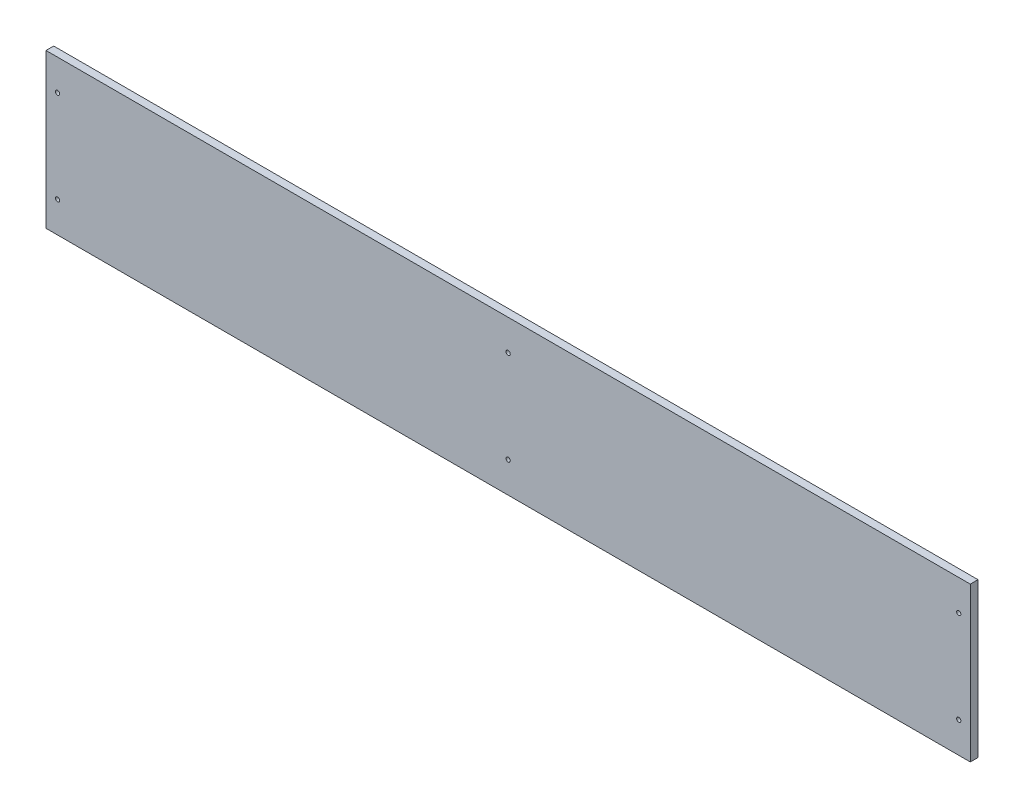
ISO-10303-21;
HEADER;
FILE_DESCRIPTION(('STEP AP214'),'2;1');
FILE_NAME('part.step','',(''),(''),'','','');
FILE_SCHEMA(('AUTOMOTIVE_DESIGN { 1 0 10303 214 1 1 1 1 }'));
ENDSEC;
DATA;
#1=APPLICATION_CONTEXT('core data for automotive mechanical design processes');
#2=APPLICATION_PROTOCOL_DEFINITION('international standard','automotive_design',2000,#1);
#3=PRODUCT_CONTEXT('',#1,'mechanical');
#4=PRODUCT('Part','Part','',(#3));
#5=PRODUCT_RELATED_PRODUCT_CATEGORY('part','',(#4));
#6=PRODUCT_DEFINITION_FORMATION('','',#4);
#7=PRODUCT_DEFINITION_CONTEXT('part definition',#1,'design');
#8=PRODUCT_DEFINITION('design','',#6,#7);
#9=PRODUCT_DEFINITION_SHAPE('','',#8);
#10=(LENGTH_UNIT() NAMED_UNIT(*) SI_UNIT(.MILLI.,.METRE.));
#11=(NAMED_UNIT(*) PLANE_ANGLE_UNIT() SI_UNIT($,.RADIAN.));
#12=(NAMED_UNIT(*) SI_UNIT($,.STERADIAN.) SOLID_ANGLE_UNIT());
#13=UNCERTAINTY_MEASURE_WITH_UNIT(LENGTH_MEASURE(1.E-05),#10,'distance_accuracy_value','');
#14=(GEOMETRIC_REPRESENTATION_CONTEXT(3) GLOBAL_UNCERTAINTY_ASSIGNED_CONTEXT((#13)) GLOBAL_UNIT_ASSIGNED_CONTEXT((#10,
#11,#12)) REPRESENTATION_CONTEXT('',''));
#15=CARTESIAN_POINT('',(0.,0.,0.));
#16=DIRECTION('',(0.,0.,1.));
#17=DIRECTION('',(1.,0.,0.));
#18=AXIS2_PLACEMENT_3D('',#15,#16,#17);
#19=CARTESIAN_POINT('',(0.,0.,10.));
#20=DIRECTION('',(1.,0.,0.));
#21=DIRECTION('',(0.,1.,0.));
#22=AXIS2_PLACEMENT_3D('',#19,#20,#21);
#23=PLANE('',#22);
#24=DIRECTION('',(0.,-1.,0.));
#25=VECTOR('',#24,1.);
#26=CARTESIAN_POINT('',(0.,0.,0.));
#27=LINE('',#26,#25);
#28=CARTESIAN_POINT('',(0.,0.,0.));
#29=VERTEX_POINT('',#28);
#30=CARTESIAN_POINT('',(0.,-200.,0.));
#31=VERTEX_POINT('',#30);
#32=EDGE_CURVE('E101',#29,#31,#27,.T.);
#33=ORIENTED_EDGE('',*,*,#32,.T.);
#34=DIRECTION('',(0.,0.,-1.));
#35=VECTOR('',#34,1.);
#36=CARTESIAN_POINT('',(0.,-200.,10.));
#37=LINE('',#36,#35);
#38=CARTESIAN_POINT('',(0.,-200.,10.));
#39=VERTEX_POINT('',#38);
#40=EDGE_CURVE('E92',#39,#31,#37,.T.);
#41=ORIENTED_EDGE('',*,*,#40,.F.);
#42=DIRECTION('',(0.,-1.,0.));
#43=VECTOR('',#42,1.);
#44=CARTESIAN_POINT('',(0.,0.,10.));
#45=LINE('',#44,#43);
#46=CARTESIAN_POINT('',(0.,0.,10.));
#47=VERTEX_POINT('',#46);
#48=EDGE_CURVE('E86',#47,#39,#45,.T.);
#49=ORIENTED_EDGE('',*,*,#48,.F.);
#50=DIRECTION('',(0.,0.,-1.));
#51=VECTOR('',#50,1.);
#52=CARTESIAN_POINT('',(0.,0.,10.));
#53=LINE('',#52,#51);
#54=EDGE_CURVE('E97',#47,#29,#53,.T.);
#55=ORIENTED_EDGE('',*,*,#54,.T.);
#56=EDGE_LOOP('',(#33,#41,#49,#55));
#57=FACE_BOUND('',#56,.T.);
#58=ADVANCED_FACE('F33',(#57),#23,.F.);
#59=CARTESIAN_POINT('',(0.,-200.,10.));
#60=DIRECTION('',(0.,1.,0.));
#61=DIRECTION('',(0.,0.,1.));
#62=AXIS2_PLACEMENT_3D('',#59,#60,#61);
#63=PLANE('',#62);
#64=DIRECTION('',(1.,0.,0.));
#65=VECTOR('',#64,1.);
#66=CARTESIAN_POINT('',(0.,-200.,0.));
#67=LINE('',#66,#65);
#68=CARTESIAN_POINT('',(1200.,-200.,0.));
#69=VERTEX_POINT('',#68);
#70=EDGE_CURVE('E91',#31,#69,#67,.T.);
#71=ORIENTED_EDGE('',*,*,#70,.T.);
#72=DIRECTION('',(0.,0.,-1.));
#73=VECTOR('',#72,1.);
#74=CARTESIAN_POINT('',(1200.,-200.,10.));
#75=LINE('',#74,#73);
#76=CARTESIAN_POINT('',(1200.,-200.,10.));
#77=VERTEX_POINT('',#76);
#78=EDGE_CURVE('E89',#77,#69,#75,.T.);
#79=ORIENTED_EDGE('',*,*,#78,.F.);
#80=DIRECTION('',(1.,0.,0.));
#81=VECTOR('',#80,1.);
#82=CARTESIAN_POINT('',(0.,-200.,10.));
#83=LINE('',#82,#81);
#84=EDGE_CURVE('E81',#39,#77,#83,.T.);
#85=ORIENTED_EDGE('',*,*,#84,.F.);
#86=ORIENTED_EDGE('',*,*,#40,.T.);
#87=EDGE_LOOP('',(#71,#79,#85,#86));
#88=FACE_BOUND('',#87,.T.);
#89=ADVANCED_FACE('F90',(#88),#63,.F.);
#90=CARTESIAN_POINT('',(1200.,0.,10.));
#91=DIRECTION('',(-1.,0.,0.));
#92=DIRECTION('',(0.,0.,1.));
#93=AXIS2_PLACEMENT_3D('',#90,#91,#92);
#94=PLANE('',#93);
#95=DIRECTION('',(0.,1.,0.));
#96=VECTOR('',#95,1.);
#97=CARTESIAN_POINT('',(1200.,0.,0.));
#98=LINE('',#97,#96);
#99=CARTESIAN_POINT('',(1200.,0.,0.));
#100=VERTEX_POINT('',#99);
#101=EDGE_CURVE('E67',#69,#100,#98,.T.);
#102=ORIENTED_EDGE('',*,*,#101,.T.);
#103=DIRECTION('',(0.,0.,-1.));
#104=VECTOR('',#103,1.);
#105=CARTESIAN_POINT('',(1200.,0.,10.));
#106=LINE('',#105,#104);
#107=CARTESIAN_POINT('',(1200.,0.,10.));
#108=VERTEX_POINT('',#107);
#109=EDGE_CURVE('E93',#108,#100,#106,.T.);
#110=ORIENTED_EDGE('',*,*,#109,.F.);
#111=DIRECTION('',(0.,1.,0.));
#112=VECTOR('',#111,1.);
#113=CARTESIAN_POINT('',(1200.,0.,10.));
#114=LINE('',#113,#112);
#115=EDGE_CURVE('E84',#77,#108,#114,.T.);
#116=ORIENTED_EDGE('',*,*,#115,.F.);
#117=ORIENTED_EDGE('',*,*,#78,.T.);
#118=EDGE_LOOP('',(#102,#110,#116,#117));
#119=FACE_BOUND('',#118,.T.);
#120=ADVANCED_FACE('F95',(#119),#94,.F.);
#121=CARTESIAN_POINT('',(0.,0.,10.));
#122=DIRECTION('',(0.,-1.,0.));
#123=DIRECTION('',(0.,0.,-1.));
#124=AXIS2_PLACEMENT_3D('',#121,#122,#123);
#125=PLANE('',#124);
#126=DIRECTION('',(-1.,0.,0.));
#127=VECTOR('',#126,1.);
#128=CARTESIAN_POINT('',(0.,0.,0.));
#129=LINE('',#128,#127);
#130=EDGE_CURVE('E73',#100,#29,#129,.T.);
#131=ORIENTED_EDGE('',*,*,#130,.T.);
#132=ORIENTED_EDGE('',*,*,#54,.F.);
#133=DIRECTION('',(-1.,0.,0.));
#134=VECTOR('',#133,1.);
#135=CARTESIAN_POINT('',(0.,0.,10.));
#136=LINE('',#135,#134);
#137=EDGE_CURVE('E50',#108,#47,#136,.T.);
#138=ORIENTED_EDGE('',*,*,#137,.F.);
#139=ORIENTED_EDGE('',*,*,#109,.T.);
#140=EDGE_LOOP('',(#131,#132,#138,#139));
#141=FACE_BOUND('',#140,.T.);
#142=ADVANCED_FACE('F162',(#141),#125,.F.);
#143=CARTESIAN_POINT('',(0.,0.,10.));
#144=DIRECTION('',(0.,0.,1.));
#145=DIRECTION('',(1.,0.,0.));
#146=AXIS2_PLACEMENT_3D('',#143,#144,#145);
#147=PLANE('',#146);
#148=CARTESIAN_POINT('',(600.,-160.,10.));
#149=DIRECTION('',(0.,0.,1.));
#150=DIRECTION('',(1.,0.,0.));
#151=AXIS2_PLACEMENT_3D('',#148,#149,#150);
#152=CIRCLE('',#151,2.75000000000004);
#153=CARTESIAN_POINT('',(602.75,-160.,10.));
#154=VERTEX_POINT('',#153);
#155=EDGE_CURVE('E218',#154,#154,#152,.T.);
#156=ORIENTED_EDGE('',*,*,#155,.F.);
#157=EDGE_LOOP('',(#156));
#158=FACE_BOUND('',#157,.T.);
#159=CARTESIAN_POINT('',(600.,-40.0000000000001,10.));
#160=DIRECTION('',(0.,0.,1.));
#161=DIRECTION('',(1.,0.,0.));
#162=AXIS2_PLACEMENT_3D('',#159,#160,#161);
#163=CIRCLE('',#162,2.75000000000004);
#164=CARTESIAN_POINT('',(602.75,-40.0000000000001,10.));
#165=VERTEX_POINT('',#164);
#166=EDGE_CURVE('E221',#165,#165,#163,.T.);
#167=ORIENTED_EDGE('',*,*,#166,.F.);
#168=EDGE_LOOP('',(#167));
#169=FACE_BOUND('',#168,.T.);
#170=CARTESIAN_POINT('',(1185.,-160.,10.));
#171=DIRECTION('',(0.,0.,1.));
#172=DIRECTION('',(1.,0.,0.));
#173=AXIS2_PLACEMENT_3D('',#170,#171,#172);
#174=CIRCLE('',#173,2.74999999999993);
#175=CARTESIAN_POINT('',(1187.75,-160.,10.));
#176=VERTEX_POINT('',#175);
#177=EDGE_CURVE('E216',#176,#176,#174,.T.);
#178=ORIENTED_EDGE('',*,*,#177,.F.);
#179=EDGE_LOOP('',(#178));
#180=FACE_BOUND('',#179,.T.);
#181=CARTESIAN_POINT('',(1185.,-40.,10.));
#182=DIRECTION('',(0.,0.,1.));
#183=DIRECTION('',(1.,0.,0.));
#184=AXIS2_PLACEMENT_3D('',#181,#182,#183);
#185=CIRCLE('',#184,2.74999999999993);
#186=CARTESIAN_POINT('',(1187.75,-40.,10.));
#187=VERTEX_POINT('',#186);
#188=EDGE_CURVE('E212',#187,#187,#185,.T.);
#189=ORIENTED_EDGE('',*,*,#188,.F.);
#190=EDGE_LOOP('',(#189));
#191=FACE_BOUND('',#190,.T.);
#192=CARTESIAN_POINT('',(15.,-160.,10.));
#193=DIRECTION('',(0.,0.,1.));
#194=DIRECTION('',(1.,0.,0.));
#195=AXIS2_PLACEMENT_3D('',#192,#193,#194);
#196=CIRCLE('',#195,2.75);
#197=CARTESIAN_POINT('',(17.75,-160.,10.));
#198=VERTEX_POINT('',#197);
#199=EDGE_CURVE('E209',#198,#198,#196,.T.);
#200=ORIENTED_EDGE('',*,*,#199,.F.);
#201=EDGE_LOOP('',(#200));
#202=FACE_BOUND('',#201,.T.);
#203=CARTESIAN_POINT('',(15.,-40.,10.));
#204=DIRECTION('',(0.,0.,1.));
#205=DIRECTION('',(1.,0.,0.));
#206=AXIS2_PLACEMENT_3D('',#203,#204,#205);
#207=CIRCLE('',#206,2.75);
#208=CARTESIAN_POINT('',(17.75,-40.,10.));
#209=VERTEX_POINT('',#208);
#210=EDGE_CURVE('E104',#209,#209,#207,.T.);
#211=ORIENTED_EDGE('',*,*,#210,.F.);
#212=EDGE_LOOP('',(#211));
#213=FACE_BOUND('',#212,.T.);
#214=ORIENTED_EDGE('',*,*,#48,.T.);
#215=ORIENTED_EDGE('',*,*,#84,.T.);
#216=ORIENTED_EDGE('',*,*,#115,.T.);
#217=ORIENTED_EDGE('',*,*,#137,.T.);
#218=EDGE_LOOP('',(#214,#215,#216,#217));
#219=FACE_BOUND('',#218,.T.);
#220=ADVANCED_FACE('F82',(#158,#169,#180,#191,#202,#213,#219),#147,.T.);
#221=CARTESIAN_POINT('',(0.,0.,0.));
#222=DIRECTION('',(0.,0.,1.));
#223=DIRECTION('',(1.,0.,0.));
#224=AXIS2_PLACEMENT_3D('',#221,#222,#223);
#225=PLANE('',#224);
#226=CARTESIAN_POINT('',(600.,-160.,0.));
#227=DIRECTION('',(0.,0.,1.));
#228=DIRECTION('',(1.,0.,0.));
#229=AXIS2_PLACEMENT_3D('',#226,#227,#228);
#230=CIRCLE('',#229,5.25000000000009);
#231=CARTESIAN_POINT('',(605.25,-160.,0.));
#232=VERTEX_POINT('',#231);
#233=EDGE_CURVE('E126',#232,#232,#230,.T.);
#234=ORIENTED_EDGE('',*,*,#233,.T.);
#235=EDGE_LOOP('',(#234));
#236=FACE_BOUND('',#235,.T.);
#237=CARTESIAN_POINT('',(600.,-40.0000000000001,0.));
#238=DIRECTION('',(0.,0.,1.));
#239=DIRECTION('',(1.,0.,0.));
#240=AXIS2_PLACEMENT_3D('',#237,#238,#239);
#241=CIRCLE('',#240,5.25000000000009);
#242=CARTESIAN_POINT('',(605.25,-40.0000000000001,0.));
#243=VERTEX_POINT('',#242);
#244=EDGE_CURVE('E123',#243,#243,#241,.T.);
#245=ORIENTED_EDGE('',*,*,#244,.T.);
#246=EDGE_LOOP('',(#245));
#247=FACE_BOUND('',#246,.T.);
#248=CARTESIAN_POINT('',(15.,-160.,0.));
#249=DIRECTION('',(0.,0.,1.));
#250=DIRECTION('',(1.,0.,0.));
#251=AXIS2_PLACEMENT_3D('',#248,#249,#250);
#252=CIRCLE('',#251,5.2500000000002);
#253=CARTESIAN_POINT('',(9.7499999999998,-160.,0.));
#254=VERTEX_POINT('',#253);
#255=EDGE_CURVE('E120',#254,#254,#252,.T.);
#256=ORIENTED_EDGE('',*,*,#255,.T.);
#257=EDGE_LOOP('',(#256));
#258=FACE_BOUND('',#257,.T.);
#259=CARTESIAN_POINT('',(15.,-40.,0.));
#260=DIRECTION('',(0.,0.,1.));
#261=DIRECTION('',(1.,0.,0.));
#262=AXIS2_PLACEMENT_3D('',#259,#260,#261);
#263=CIRCLE('',#262,5.2500000000002);
#264=CARTESIAN_POINT('',(9.7499999999998,-40.,0.));
#265=VERTEX_POINT('',#264);
#266=EDGE_CURVE('E117',#265,#265,#263,.T.);
#267=ORIENTED_EDGE('',*,*,#266,.T.);
#268=EDGE_LOOP('',(#267));
#269=FACE_BOUND('',#268,.T.);
#270=CARTESIAN_POINT('',(1185.,-40.,0.));
#271=DIRECTION('',(0.,0.,1.));
#272=DIRECTION('',(1.,0.,0.));
#273=AXIS2_PLACEMENT_3D('',#270,#271,#272);
#274=CIRCLE('',#273,5.24999999999975);
#275=CARTESIAN_POINT('',(1190.25,-40.,0.));
#276=VERTEX_POINT('',#275);
#277=EDGE_CURVE('E114',#276,#276,#274,.T.);
#278=ORIENTED_EDGE('',*,*,#277,.T.);
#279=EDGE_LOOP('',(#278));
#280=FACE_BOUND('',#279,.T.);
#281=CARTESIAN_POINT('',(1185.,-160.,0.));
#282=DIRECTION('',(0.,0.,1.));
#283=DIRECTION('',(1.,0.,0.));
#284=AXIS2_PLACEMENT_3D('',#281,#282,#283);
#285=CIRCLE('',#284,5.24999999999975);
#286=CARTESIAN_POINT('',(1190.25,-160.,0.));
#287=VERTEX_POINT('',#286);
#288=EDGE_CURVE('E111',#287,#287,#285,.T.);
#289=ORIENTED_EDGE('',*,*,#288,.T.);
#290=EDGE_LOOP('',(#289));
#291=FACE_BOUND('',#290,.T.);
#292=ORIENTED_EDGE('',*,*,#32,.F.);
#293=ORIENTED_EDGE('',*,*,#130,.F.);
#294=ORIENTED_EDGE('',*,*,#101,.F.);
#295=ORIENTED_EDGE('',*,*,#70,.F.);
#296=EDGE_LOOP('',(#292,#293,#294,#295));
#297=FACE_BOUND('',#296,.T.);
#298=ADVANCED_FACE('F152',(#236,#247,#258,#269,#280,#291,#297),#225,.F.);
#299=CARTESIAN_POINT('',(15.,-40.,0.));
#300=DIRECTION('',(0.,0.,1.));
#301=DIRECTION('',(1.,0.,0.));
#302=AXIS2_PLACEMENT_3D('',#299,#300,#301);
#303=CYLINDRICAL_SURFACE('',#302,2.75);
#304=CARTESIAN_POINT('',(15.,-40.,2.5000000000003));
#305=DIRECTION('',(0.,0.,1.));
#306=DIRECTION('',(1.,0.,0.));
#307=AXIS2_PLACEMENT_3D('',#304,#305,#306);
#308=CIRCLE('',#307,2.75);
#309=CARTESIAN_POINT('',(12.25,-40.,2.5000000000003));
#310=VERTEX_POINT('',#309);
#311=EDGE_CURVE('E138',#310,#310,#308,.F.);
#312=ORIENTED_EDGE('',*,*,#311,.T.);
#313=EDGE_LOOP('',(#312));
#314=FACE_BOUND('',#313,.T.);
#315=ORIENTED_EDGE('',*,*,#210,.T.);
#316=EDGE_LOOP('',(#315));
#317=FACE_BOUND('',#316,.T.);
#318=ADVANCED_FACE('F155',(#314,#317),#303,.F.);
#319=CARTESIAN_POINT('',(15.,-160.,0.));
#320=DIRECTION('',(0.,0.,1.));
#321=DIRECTION('',(1.,0.,0.));
#322=AXIS2_PLACEMENT_3D('',#319,#320,#321);
#323=CYLINDRICAL_SURFACE('',#322,2.75);
#324=CARTESIAN_POINT('',(15.,-160.,2.5000000000003));
#325=DIRECTION('',(0.,0.,1.));
#326=DIRECTION('',(1.,0.,0.));
#327=AXIS2_PLACEMENT_3D('',#324,#325,#326);
#328=CIRCLE('',#327,2.75);
#329=CARTESIAN_POINT('',(12.25,-160.,2.5000000000003));
#330=VERTEX_POINT('',#329);
#331=EDGE_CURVE('E135',#330,#330,#328,.F.);
#332=ORIENTED_EDGE('',*,*,#331,.T.);
#333=EDGE_LOOP('',(#332));
#334=FACE_BOUND('',#333,.T.);
#335=ORIENTED_EDGE('',*,*,#199,.T.);
#336=EDGE_LOOP('',(#335));
#337=FACE_BOUND('',#336,.T.);
#338=ADVANCED_FACE('F204',(#334,#337),#323,.F.);
#339=CARTESIAN_POINT('',(1185.,-40.,0.));
#340=DIRECTION('',(0.,0.,1.));
#341=DIRECTION('',(1.,0.,0.));
#342=AXIS2_PLACEMENT_3D('',#339,#340,#341);
#343=CYLINDRICAL_SURFACE('',#342,2.74999999999993);
#344=CARTESIAN_POINT('',(1185.,-40.,2.49999999999983));
#345=DIRECTION('',(0.,0.,1.));
#346=DIRECTION('',(1.,0.,0.));
#347=AXIS2_PLACEMENT_3D('',#344,#345,#346);
#348=CIRCLE('',#347,2.74999999999993);
#349=CARTESIAN_POINT('',(1187.75,-40.,2.49999999999983));
#350=VERTEX_POINT('',#349);
#351=EDGE_CURVE('E42',#350,#350,#348,.F.);
#352=ORIENTED_EDGE('',*,*,#351,.T.);
#353=EDGE_LOOP('',(#352));
#354=FACE_BOUND('',#353,.T.);
#355=ORIENTED_EDGE('',*,*,#188,.T.);
#356=EDGE_LOOP('',(#355));
#357=FACE_BOUND('',#356,.T.);
#358=ADVANCED_FACE('F143',(#354,#357),#343,.F.);
#359=CARTESIAN_POINT('',(1185.,-160.,0.));
#360=DIRECTION('',(0.,0.,1.));
#361=DIRECTION('',(1.,0.,0.));
#362=AXIS2_PLACEMENT_3D('',#359,#360,#361);
#363=CYLINDRICAL_SURFACE('',#362,2.74999999999993);
#364=CARTESIAN_POINT('',(1185.,-160.,2.49999999999984));
#365=DIRECTION('',(0.,0.,1.));
#366=DIRECTION('',(1.,0.,0.));
#367=AXIS2_PLACEMENT_3D('',#364,#365,#366);
#368=CIRCLE('',#367,2.74999999999993);
#369=CARTESIAN_POINT('',(1187.75,-160.,2.49999999999984));
#370=VERTEX_POINT('',#369);
#371=EDGE_CURVE('E11',#370,#370,#368,.F.);
#372=ORIENTED_EDGE('',*,*,#371,.T.);
#373=EDGE_LOOP('',(#372));
#374=FACE_BOUND('',#373,.T.);
#375=ORIENTED_EDGE('',*,*,#177,.T.);
#376=EDGE_LOOP('',(#375));
#377=FACE_BOUND('',#376,.T.);
#378=ADVANCED_FACE('F227',(#374,#377),#363,.F.);
#379=CARTESIAN_POINT('',(600.,-40.0000000000001,0.));
#380=DIRECTION('',(0.,0.,1.));
#381=DIRECTION('',(1.,0.,0.));
#382=AXIS2_PLACEMENT_3D('',#379,#380,#381);
#383=CYLINDRICAL_SURFACE('',#382,2.75000000000004);
#384=CARTESIAN_POINT('',(600.,-40.0000000000001,2.50000000000006));
#385=DIRECTION('',(0.,0.,1.));
#386=DIRECTION('',(1.,0.,0.));
#387=AXIS2_PLACEMENT_3D('',#384,#385,#386);
#388=CIRCLE('',#387,2.75000000000004);
#389=CARTESIAN_POINT('',(602.75,-40.0000000000001,2.50000000000006));
#390=VERTEX_POINT('',#389);
#391=EDGE_CURVE('E132',#390,#390,#388,.F.);
#392=ORIENTED_EDGE('',*,*,#391,.T.);
#393=EDGE_LOOP('',(#392));
#394=FACE_BOUND('',#393,.T.);
#395=ORIENTED_EDGE('',*,*,#166,.T.);
#396=EDGE_LOOP('',(#395));
#397=FACE_BOUND('',#396,.T.);
#398=ADVANCED_FACE('F244',(#394,#397),#383,.F.);
#399=CARTESIAN_POINT('',(600.,-160.,0.));
#400=DIRECTION('',(0.,0.,1.));
#401=DIRECTION('',(1.,0.,0.));
#402=AXIS2_PLACEMENT_3D('',#399,#400,#401);
#403=CYLINDRICAL_SURFACE('',#402,2.75000000000004);
#404=CARTESIAN_POINT('',(600.,-160.,2.50000000000006));
#405=DIRECTION('',(0.,0.,1.));
#406=DIRECTION('',(1.,0.,0.));
#407=AXIS2_PLACEMENT_3D('',#404,#405,#406);
#408=CIRCLE('',#407,2.75000000000004);
#409=CARTESIAN_POINT('',(602.75,-160.,2.50000000000006));
#410=VERTEX_POINT('',#409);
#411=EDGE_CURVE('E129',#410,#410,#408,.F.);
#412=ORIENTED_EDGE('',*,*,#411,.T.);
#413=EDGE_LOOP('',(#412));
#414=FACE_BOUND('',#413,.T.);
#415=ORIENTED_EDGE('',*,*,#155,.T.);
#416=EDGE_LOOP('',(#415));
#417=FACE_BOUND('',#416,.T.);
#418=ADVANCED_FACE('F184',(#414,#417),#403,.F.);
#419=CARTESIAN_POINT('',(600.,-160.,0.));
#420=DIRECTION('',(0.,0.,-1.));
#421=DIRECTION('',(-1.,0.,0.));
#422=AXIS2_PLACEMENT_3D('',#419,#420,#421);
#423=CONICAL_SURFACE('',#422,5.25000000000009,0.785398163397446);
#424=ORIENTED_EDGE('',*,*,#411,.F.);
#425=EDGE_LOOP('',(#424));
#426=FACE_BOUND('',#425,.T.);
#427=ORIENTED_EDGE('',*,*,#233,.F.);
#428=EDGE_LOOP('',(#427));
#429=FACE_BOUND('',#428,.T.);
#430=ADVANCED_FACE('F180',(#426,#429),#423,.F.);
#431=CARTESIAN_POINT('',(600.,-40.0000000000001,0.));
#432=DIRECTION('',(0.,0.,-1.));
#433=DIRECTION('',(-1.,0.,0.));
#434=AXIS2_PLACEMENT_3D('',#431,#432,#433);
#435=CONICAL_SURFACE('',#434,5.25000000000009,0.785398163397446);
#436=ORIENTED_EDGE('',*,*,#391,.F.);
#437=EDGE_LOOP('',(#436));
#438=FACE_BOUND('',#437,.T.);
#439=ORIENTED_EDGE('',*,*,#244,.F.);
#440=EDGE_LOOP('',(#439));
#441=FACE_BOUND('',#440,.T.);
#442=ADVANCED_FACE('F183',(#438,#441),#435,.F.);
#443=CARTESIAN_POINT('',(15.,-160.,0.));
#444=DIRECTION('',(0.,0.,-1.));
#445=DIRECTION('',(-1.,0.,0.));
#446=AXIS2_PLACEMENT_3D('',#443,#444,#445);
#447=CONICAL_SURFACE('',#446,5.2500000000002,0.785398163397428);
#448=CARTESIAN_POINT('',(12.25,-160.,2.5000000000003));
#449=CARTESIAN_POINT('',(12.2239583333333,-160.,2.47395833333363));
#450=CARTESIAN_POINT('',(12.1979166666667,-160.,2.44791666666696));
#451=CARTESIAN_POINT('',(12.1458333333333,-160.,2.39583333333362));
#452=CARTESIAN_POINT('',(12.1197916666667,-160.,2.36979166666695));
#453=CARTESIAN_POINT('',(12.0677083333333,-160.,2.31770833333361));
#454=CARTESIAN_POINT('',(12.0416666666667,-160.,2.29166666666694));
#455=CARTESIAN_POINT('',(11.9895833333333,-160.,2.2395833333336));
#456=CARTESIAN_POINT('',(11.9635416666666,-160.,2.21354166666693));
#457=CARTESIAN_POINT('',(11.9114583333333,-160.,2.16145833333359));
#458=CARTESIAN_POINT('',(11.8854166666666,-160.,2.13541666666692));
#459=CARTESIAN_POINT('',(11.8333333333333,-160.,2.08333333333358));
#460=CARTESIAN_POINT('',(11.8072916666666,-160.,2.05729166666691));
#461=CARTESIAN_POINT('',(11.7552083333333,-160.,2.00520833333358));
#462=CARTESIAN_POINT('',(11.7291666666666,-160.,1.97916666666691));
#463=CARTESIAN_POINT('',(11.6770833333333,-160.,1.92708333333357));
#464=CARTESIAN_POINT('',(11.6510416666666,-160.,1.9010416666669));
#465=CARTESIAN_POINT('',(11.5989583333333,-160.,1.84895833333356));
#466=CARTESIAN_POINT('',(11.5729166666666,-160.,1.82291666666689));
#467=CARTESIAN_POINT('',(11.5208333333333,-160.,1.77083333333355));
#468=CARTESIAN_POINT('',(11.4947916666666,-160.,1.74479166666688));
#469=CARTESIAN_POINT('',(11.4427083333333,-160.,1.69270833333354));
#470=CARTESIAN_POINT('',(11.4166666666666,-160.,1.66666666666687));
#471=CARTESIAN_POINT('',(11.3645833333333,-160.,1.61458333333353));
#472=CARTESIAN_POINT('',(11.3385416666666,-160.,1.58854166666686));
#473=CARTESIAN_POINT('',(11.2864583333333,-160.,1.53645833333352));
#474=CARTESIAN_POINT('',(11.2604166666666,-160.,1.51041666666685));
#475=CARTESIAN_POINT('',(11.2083333333333,-160.,1.45833333333351));
#476=CARTESIAN_POINT('',(11.1822916666666,-160.,1.43229166666684));
#477=CARTESIAN_POINT('',(11.1302083333332,-160.,1.3802083333335));
#478=CARTESIAN_POINT('',(11.1041666666666,-160.,1.35416666666683));
#479=CARTESIAN_POINT('',(11.0520833333332,-160.,1.30208333333349));
#480=CARTESIAN_POINT('',(11.0260416666666,-160.,1.27604166666682));
#481=CARTESIAN_POINT('',(10.9739583333332,-160.,1.22395833333348));
#482=CARTESIAN_POINT('',(10.9479166666666,-160.,1.19791666666681));
#483=CARTESIAN_POINT('',(10.8958333333332,-160.,1.14583333333347));
#484=CARTESIAN_POINT('',(10.8697916666666,-160.,1.1197916666668));
#485=CARTESIAN_POINT('',(10.8177083333332,-160.,1.06770833333346));
#486=CARTESIAN_POINT('',(10.7916666666666,-160.,1.04166666666679));
#487=CARTESIAN_POINT('',(10.7395833333332,-160.,0.989583333333452));
#488=CARTESIAN_POINT('',(10.7135416666665,-160.,0.963541666666783));
#489=CARTESIAN_POINT('',(10.6614583333332,-160.,0.911458333333444));
#490=CARTESIAN_POINT('',(10.6354166666665,-160.,0.885416666666774));
#491=CARTESIAN_POINT('',(10.5833333333332,-160.,0.833333333333434));
#492=CARTESIAN_POINT('',(10.5572916666665,-160.,0.807291666666764));
#493=CARTESIAN_POINT('',(10.5052083333332,-160.,0.755208333333424));
#494=CARTESIAN_POINT('',(10.4791666666665,-160.,0.729166666666755));
#495=CARTESIAN_POINT('',(10.4270833333332,-160.,0.677083333333415));
#496=CARTESIAN_POINT('',(10.4010416666665,-160.,0.651041666666745));
#497=CARTESIAN_POINT('',(10.3489583333332,-160.,0.598958333333406));
#498=CARTESIAN_POINT('',(10.3229166666665,-160.,0.572916666666736));
#499=CARTESIAN_POINT('',(10.2708333333332,-160.,0.520833333333396));
#500=CARTESIAN_POINT('',(10.2447916666665,-160.,0.494791666666726));
#501=CARTESIAN_POINT('',(10.1927083333332,-160.,0.442708333333387));
#502=CARTESIAN_POINT('',(10.1666666666665,-160.,0.416666666666717));
#503=CARTESIAN_POINT('',(10.1145833333332,-160.,0.364583333333377));
#504=CARTESIAN_POINT('',(10.0885416666665,-160.,0.338541666666708));
#505=CARTESIAN_POINT('',(10.0364583333332,-160.,0.286458333333368));
#506=CARTESIAN_POINT('',(10.0104166666665,-160.,0.260416666666698));
#507=CARTESIAN_POINT('',(9.95833333333315,-160.,0.208333333333358));
#508=CARTESIAN_POINT('',(9.93229166666648,-160.,0.182291666666689));
#509=CARTESIAN_POINT('',(9.88020833333314,-160.,0.130208333333349));
#510=CARTESIAN_POINT('',(9.85416666666647,-160.,0.104166666666679));
#511=CARTESIAN_POINT('',(9.80208333333314,-160.,0.05208333333334));
#512=CARTESIAN_POINT('',(9.77604166666647,-160.,0.0260416666666702));
#513=CARTESIAN_POINT('',(9.7499999999998,-160.,0.));
#514=B_SPLINE_CURVE_WITH_KNOTS('',3,(#448,#449,#450,#451,#452,#453,#454,#455,#456,#457,#458,
#459,#460,#461,#462,#463,#464,#465,#466,#467,#468,#469,#470,#471,#472,#473,#474,#475,#476,#477,
#478,#479,#480,#481,#482,#483,#484,#485,#486,#487,#488,#489,#490,#491,#492,#493,#494,#495,#496,
#497,#498,#499,#500,#501,#502,#503,#504,#505,#506,#507,#508,#509,#510,#511,#512,#513),
.UNSPECIFIED.,.F.,.F.,(4,2,2,2,2,2,2,2,2,2,2,2,2,2,2,2,2,2,2,2,2,2,2,2,2,2,2,2,2,2,2,2,4),(0.,
0.110485434560409,0.220970869120817,0.331456303681227,0.441941738241636,0.552427172802045,
0.662912607362454,0.773398041922864,0.883883476483272,0.994368911043681,1.10485434560409,
1.2153397801645,1.32582521472491,1.43631064928532,1.54679608384573,1.65728151840614,
1.76776695296655,1.87825238752695,1.98873782208736,2.09922325664777,2.20970869120818,
2.32019412576859,2.430679560329,2.54116499488941,2.65165042944982,2.76213586401023,
2.87262129857064,2.98310673313105,3.09359216769146,3.20407760225186,3.31456303681227,
3.42504847137268,3.53553390593309),.UNSPECIFIED.);
#515=EDGE_CURVE('BSEAM188',#330,#254,#514,.T.);
#516=ORIENTED_EDGE('',*,*,#331,.F.);
#517=ORIENTED_EDGE('',*,*,#255,.F.);
#518=ORIENTED_EDGE('',*,*,#515,.T.);
#519=ORIENTED_EDGE('',*,*,#515,.F.);
#520=EDGE_LOOP('',(#516,#518,#517,#519));
#521=FACE_BOUND('',#520,.T.);
#522=ADVANCED_FACE('F188',(#521),#447,.F.);
#523=CARTESIAN_POINT('',(15.,-40.,0.));
#524=DIRECTION('',(0.,0.,-1.));
#525=DIRECTION('',(-1.,0.,0.));
#526=AXIS2_PLACEMENT_3D('',#523,#524,#525);
#527=CONICAL_SURFACE('',#526,5.2500000000002,0.785398163397428);
#528=CARTESIAN_POINT('',(12.25,-40.,2.5000000000003));
#529=CARTESIAN_POINT('',(12.2239583333333,-40.,2.47395833333363));
#530=CARTESIAN_POINT('',(12.1979166666667,-40.,2.44791666666696));
#531=CARTESIAN_POINT('',(12.1458333333333,-40.,2.39583333333362));
#532=CARTESIAN_POINT('',(12.1197916666667,-40.,2.36979166666695));
#533=CARTESIAN_POINT('',(12.0677083333333,-40.,2.31770833333361));
#534=CARTESIAN_POINT('',(12.0416666666667,-40.,2.29166666666694));
#535=CARTESIAN_POINT('',(11.9895833333333,-40.,2.2395833333336));
#536=CARTESIAN_POINT('',(11.9635416666666,-40.,2.21354166666693));
#537=CARTESIAN_POINT('',(11.9114583333333,-40.,2.16145833333359));
#538=CARTESIAN_POINT('',(11.8854166666666,-40.,2.13541666666692));
#539=CARTESIAN_POINT('',(11.8333333333333,-40.,2.08333333333358));
#540=CARTESIAN_POINT('',(11.8072916666666,-40.,2.05729166666691));
#541=CARTESIAN_POINT('',(11.7552083333333,-40.,2.00520833333358));
#542=CARTESIAN_POINT('',(11.7291666666666,-40.,1.97916666666691));
#543=CARTESIAN_POINT('',(11.6770833333333,-40.,1.92708333333357));
#544=CARTESIAN_POINT('',(11.6510416666666,-40.,1.9010416666669));
#545=CARTESIAN_POINT('',(11.5989583333333,-40.,1.84895833333356));
#546=CARTESIAN_POINT('',(11.5729166666666,-40.,1.82291666666689));
#547=CARTESIAN_POINT('',(11.5208333333333,-40.,1.77083333333355));
#548=CARTESIAN_POINT('',(11.4947916666666,-40.,1.74479166666688));
#549=CARTESIAN_POINT('',(11.4427083333333,-40.,1.69270833333354));
#550=CARTESIAN_POINT('',(11.4166666666666,-40.,1.66666666666687));
#551=CARTESIAN_POINT('',(11.3645833333333,-40.,1.61458333333353));
#552=CARTESIAN_POINT('',(11.3385416666666,-40.,1.58854166666686));
#553=CARTESIAN_POINT('',(11.2864583333333,-40.,1.53645833333352));
#554=CARTESIAN_POINT('',(11.2604166666666,-40.,1.51041666666685));
#555=CARTESIAN_POINT('',(11.2083333333333,-40.,1.45833333333351));
#556=CARTESIAN_POINT('',(11.1822916666666,-40.,1.43229166666684));
#557=CARTESIAN_POINT('',(11.1302083333332,-40.,1.3802083333335));
#558=CARTESIAN_POINT('',(11.1041666666666,-40.,1.35416666666683));
#559=CARTESIAN_POINT('',(11.0520833333332,-40.,1.30208333333349));
#560=CARTESIAN_POINT('',(11.0260416666666,-40.,1.27604166666682));
#561=CARTESIAN_POINT('',(10.9739583333332,-40.,1.22395833333348));
#562=CARTESIAN_POINT('',(10.9479166666666,-40.,1.19791666666681));
#563=CARTESIAN_POINT('',(10.8958333333332,-40.,1.14583333333347));
#564=CARTESIAN_POINT('',(10.8697916666666,-40.,1.1197916666668));
#565=CARTESIAN_POINT('',(10.8177083333332,-40.,1.06770833333346));
#566=CARTESIAN_POINT('',(10.7916666666666,-40.,1.04166666666679));
#567=CARTESIAN_POINT('',(10.7395833333332,-40.,0.989583333333452));
#568=CARTESIAN_POINT('',(10.7135416666665,-40.,0.963541666666783));
#569=CARTESIAN_POINT('',(10.6614583333332,-40.,0.911458333333444));
#570=CARTESIAN_POINT('',(10.6354166666665,-40.,0.885416666666774));
#571=CARTESIAN_POINT('',(10.5833333333332,-40.,0.833333333333434));
#572=CARTESIAN_POINT('',(10.5572916666665,-40.,0.807291666666764));
#573=CARTESIAN_POINT('',(10.5052083333332,-40.,0.755208333333424));
#574=CARTESIAN_POINT('',(10.4791666666665,-40.,0.729166666666755));
#575=CARTESIAN_POINT('',(10.4270833333332,-40.,0.677083333333415));
#576=CARTESIAN_POINT('',(10.4010416666665,-40.,0.651041666666745));
#577=CARTESIAN_POINT('',(10.3489583333332,-40.,0.598958333333406));
#578=CARTESIAN_POINT('',(10.3229166666665,-40.,0.572916666666736));
#579=CARTESIAN_POINT('',(10.2708333333332,-40.,0.520833333333396));
#580=CARTESIAN_POINT('',(10.2447916666665,-40.,0.494791666666726));
#581=CARTESIAN_POINT('',(10.1927083333332,-40.,0.442708333333387));
#582=CARTESIAN_POINT('',(10.1666666666665,-40.,0.416666666666717));
#583=CARTESIAN_POINT('',(10.1145833333332,-40.,0.364583333333377));
#584=CARTESIAN_POINT('',(10.0885416666665,-40.,0.338541666666708));
#585=CARTESIAN_POINT('',(10.0364583333332,-40.,0.286458333333368));
#586=CARTESIAN_POINT('',(10.0104166666665,-40.,0.260416666666698));
#587=CARTESIAN_POINT('',(9.95833333333315,-40.,0.208333333333358));
#588=CARTESIAN_POINT('',(9.93229166666648,-40.,0.182291666666689));
#589=CARTESIAN_POINT('',(9.88020833333314,-40.,0.130208333333349));
#590=CARTESIAN_POINT('',(9.85416666666647,-40.,0.104166666666679));
#591=CARTESIAN_POINT('',(9.80208333333314,-40.,0.05208333333334));
#592=CARTESIAN_POINT('',(9.77604166666647,-40.,0.0260416666666702));
#593=CARTESIAN_POINT('',(9.7499999999998,-40.,0.));
#594=B_SPLINE_CURVE_WITH_KNOTS('',3,(#528,#529,#530,#531,#532,#533,#534,#535,#536,#537,#538,
#539,#540,#541,#542,#543,#544,#545,#546,#547,#548,#549,#550,#551,#552,#553,#554,#555,#556,#557,
#558,#559,#560,#561,#562,#563,#564,#565,#566,#567,#568,#569,#570,#571,#572,#573,#574,#575,#576,
#577,#578,#579,#580,#581,#582,#583,#584,#585,#586,#587,#588,#589,#590,#591,#592,#593),
.UNSPECIFIED.,.F.,.F.,(4,2,2,2,2,2,2,2,2,2,2,2,2,2,2,2,2,2,2,2,2,2,2,2,2,2,2,2,2,2,2,2,4),(0.,
0.110485434560409,0.220970869120817,0.331456303681227,0.441941738241636,0.552427172802045,
0.662912607362454,0.773398041922864,0.883883476483272,0.994368911043681,1.10485434560409,
1.2153397801645,1.32582521472491,1.43631064928532,1.54679608384573,1.65728151840614,
1.76776695296655,1.87825238752695,1.98873782208736,2.09922325664777,2.20970869120818,
2.32019412576859,2.430679560329,2.54116499488941,2.65165042944982,2.76213586401023,
2.87262129857064,2.98310673313105,3.09359216769146,3.20407760225186,3.31456303681227,
3.42504847137268,3.53553390593309),.UNSPECIFIED.);
#595=EDGE_CURVE('BSEAM149',#310,#265,#594,.T.);
#596=ORIENTED_EDGE('',*,*,#311,.F.);
#597=ORIENTED_EDGE('',*,*,#266,.F.);
#598=ORIENTED_EDGE('',*,*,#595,.T.);
#599=ORIENTED_EDGE('',*,*,#595,.F.);
#600=EDGE_LOOP('',(#596,#598,#597,#599));
#601=FACE_BOUND('',#600,.T.);
#602=ADVANCED_FACE('F149',(#601),#527,.F.);
#603=CARTESIAN_POINT('',(1185.,-40.,0.));
#604=DIRECTION('',(0.,0.,-1.));
#605=DIRECTION('',(-1.,0.,0.));
#606=AXIS2_PLACEMENT_3D('',#603,#604,#605);
#607=CONICAL_SURFACE('',#606,5.24999999999975,0.785398163397446);
#608=ORIENTED_EDGE('',*,*,#351,.F.);
#609=EDGE_LOOP('',(#608));
#610=FACE_BOUND('',#609,.T.);
#611=ORIENTED_EDGE('',*,*,#277,.F.);
#612=EDGE_LOOP('',(#611));
#613=FACE_BOUND('',#612,.T.);
#614=ADVANCED_FACE('F146',(#610,#613),#607,.F.);
#615=CARTESIAN_POINT('',(1185.,-160.,0.));
#616=DIRECTION('',(0.,0.,-1.));
#617=DIRECTION('',(-1.,0.,0.));
#618=AXIS2_PLACEMENT_3D('',#615,#616,#617);
#619=CONICAL_SURFACE('',#618,5.24999999999975,0.785398163397446);
#620=ORIENTED_EDGE('',*,*,#371,.F.);
#621=EDGE_LOOP('',(#620));
#622=FACE_BOUND('',#621,.T.);
#623=ORIENTED_EDGE('',*,*,#288,.F.);
#624=EDGE_LOOP('',(#623));
#625=FACE_BOUND('',#624,.T.);
#626=ADVANCED_FACE('F35',(#622,#625),#619,.F.);
#627=CLOSED_SHELL('',(#58,#89,#120,#142,#220,#298,#318,#338,#358,#378,#398,#418,#430,#442,#522,
#602,#614,#626));
#628=MANIFOLD_SOLID_BREP('B2',#627);
#629=ADVANCED_BREP_SHAPE_REPRESENTATION('',(#18,#628),#14);
#630=SHAPE_DEFINITION_REPRESENTATION(#9,#629);
ENDSEC;
END-ISO-10303-21;
